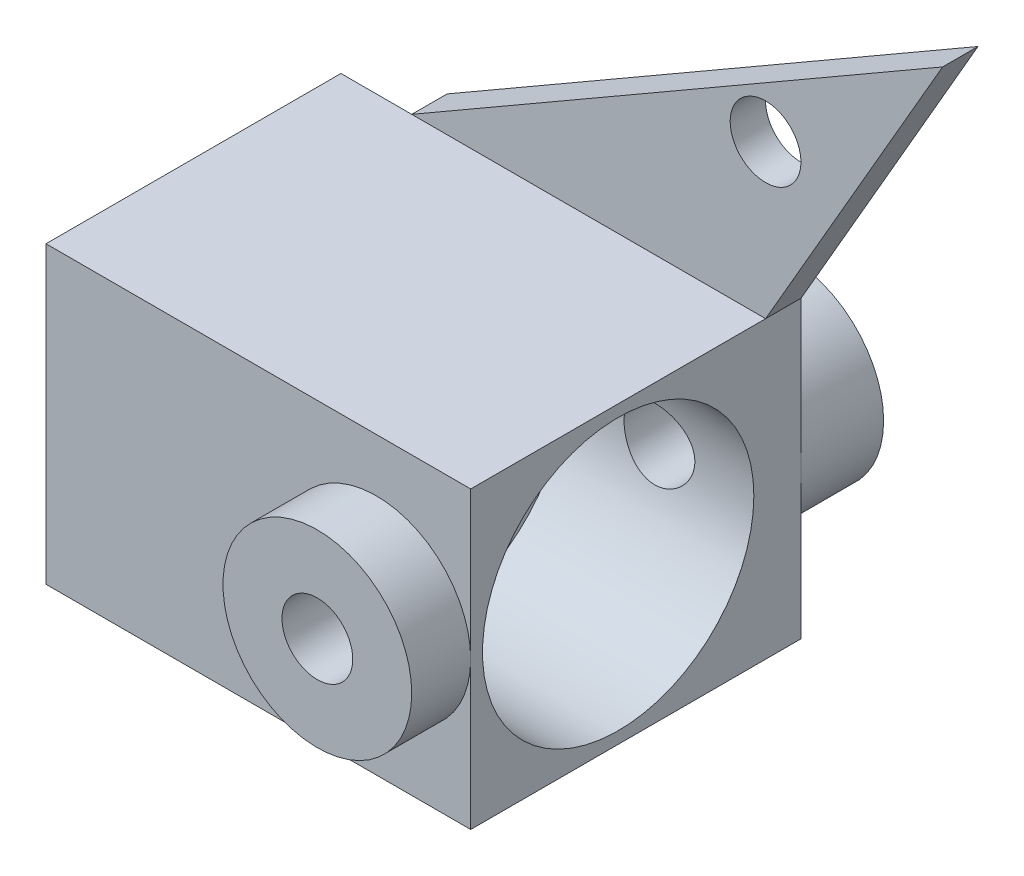
ISO-10303-21;
HEADER;
FILE_DESCRIPTION(('STEP AP214'),'2;1');
FILE_NAME('part.step','',(''),(''),'','','');
FILE_SCHEMA(('AUTOMOTIVE_DESIGN { 1 0 10303 214 1 1 1 1 }'));
ENDSEC;
DATA;
#1=APPLICATION_CONTEXT('core data for automotive mechanical design processes');
#2=APPLICATION_PROTOCOL_DEFINITION('international standard','automotive_design',2000,#1);
#3=PRODUCT_CONTEXT('',#1,'mechanical');
#4=PRODUCT('Part','Part','',(#3));
#5=PRODUCT_RELATED_PRODUCT_CATEGORY('part','',(#4));
#6=PRODUCT_DEFINITION_FORMATION('','',#4);
#7=PRODUCT_DEFINITION_CONTEXT('part definition',#1,'design');
#8=PRODUCT_DEFINITION('design','',#6,#7);
#9=PRODUCT_DEFINITION_SHAPE('','',#8);
#10=(LENGTH_UNIT() NAMED_UNIT(*) SI_UNIT(.MILLI.,.METRE.));
#11=(NAMED_UNIT(*) PLANE_ANGLE_UNIT() SI_UNIT($,.RADIAN.));
#12=(NAMED_UNIT(*) SI_UNIT($,.STERADIAN.) SOLID_ANGLE_UNIT());
#13=UNCERTAINTY_MEASURE_WITH_UNIT(LENGTH_MEASURE(1.E-05),#10,'distance_accuracy_value','');
#14=(GEOMETRIC_REPRESENTATION_CONTEXT(3) GLOBAL_UNCERTAINTY_ASSIGNED_CONTEXT((#13)) GLOBAL_UNIT_ASSIGNED_CONTEXT((#10,
#11,#12)) REPRESENTATION_CONTEXT('',''));
#15=CARTESIAN_POINT('',(0.,0.,0.));
#16=DIRECTION('',(0.,0.,1.));
#17=DIRECTION('',(1.,0.,0.));
#18=AXIS2_PLACEMENT_3D('',#15,#16,#17);
#19=CARTESIAN_POINT('',(0.,12.5,25.));
#20=DIRECTION('',(0.,1.,0.));
#21=DIRECTION('',(0.,0.,1.));
#22=AXIS2_PLACEMENT_3D('',#19,#20,#21);
#23=PLANE('',#22);
#24=DIRECTION('',(0.,0.,-1.));
#25=VECTOR('',#24,1.);
#26=CARTESIAN_POINT('',(17.5,12.5,25.));
#27=LINE('',#26,#25);
#28=CARTESIAN_POINT('',(17.5,12.5,25.));
#29=VERTEX_POINT('',#28);
#30=CARTESIAN_POINT('',(17.5,12.5,0.));
#31=VERTEX_POINT('',#30);
#32=EDGE_CURVE('E54',#29,#31,#27,.T.);
#33=ORIENTED_EDGE('',*,*,#32,.T.);
#34=DIRECTION('',(-1.,0.,0.));
#35=VECTOR('',#34,1.);
#36=CARTESIAN_POINT('',(17.5,12.5,0.));
#37=LINE('',#36,#35);
#38=CARTESIAN_POINT('',(-12.5,12.5,0.));
#39=VERTEX_POINT('',#38);
#40=EDGE_CURVE('E158',#31,#39,#37,.T.);
#41=ORIENTED_EDGE('',*,*,#40,.T.);
#42=DIRECTION('',(1.,0.,0.));
#43=VECTOR('',#42,1.);
#44=CARTESIAN_POINT('',(0.,12.5,0.));
#45=LINE('',#44,#43);
#46=CARTESIAN_POINT('',(-18.5,12.5,0.));
#47=VERTEX_POINT('',#46);
#48=EDGE_CURVE('E125',#47,#39,#45,.T.);
#49=ORIENTED_EDGE('',*,*,#48,.F.);
#50=DIRECTION('',(0.,0.,-1.));
#51=VECTOR('',#50,1.);
#52=CARTESIAN_POINT('',(-18.5,12.5,0.));
#53=LINE('',#52,#51);
#54=CARTESIAN_POINT('',(-18.5,12.5,25.));
#55=VERTEX_POINT('',#54);
#56=EDGE_CURVE('E141',#55,#47,#53,.T.);
#57=ORIENTED_EDGE('',*,*,#56,.F.);
#58=DIRECTION('',(1.,0.,0.));
#59=VECTOR('',#58,1.);
#60=CARTESIAN_POINT('',(0.,12.5,25.));
#61=LINE('',#60,#59);
#62=EDGE_CURVE('E214',#55,#29,#61,.T.);
#63=ORIENTED_EDGE('',*,*,#62,.T.);
#64=EDGE_LOOP('',(#33,#41,#49,#57,#63));
#65=FACE_BOUND('',#64,.T.);
#66=ADVANCED_FACE('F46',(#65),#23,.T.);
#67=CARTESIAN_POINT('',(0.,0.,0.));
#68=DIRECTION('',(0.,0.,1.));
#69=DIRECTION('',(1.,0.,0.));
#70=AXIS2_PLACEMENT_3D('',#67,#68,#69);
#71=PLANE('',#70);
#72=DIRECTION('',(0.,1.,0.));
#73=VECTOR('',#72,1.);
#74=CARTESIAN_POINT('',(-12.5,0.,0.));
#75=LINE('',#74,#73);
#76=CARTESIAN_POINT('',(-12.5,-12.5,0.));
#77=VERTEX_POINT('',#76);
#78=EDGE_CURVE('E122',#77,#39,#75,.T.);
#79=ORIENTED_EDGE('',*,*,#78,.F.);
#80=DIRECTION('',(1.,0.,0.));
#81=VECTOR('',#80,1.);
#82=CARTESIAN_POINT('',(0.,-12.5,0.));
#83=LINE('',#82,#81);
#84=CARTESIAN_POINT('',(-18.5,-12.5,0.));
#85=VERTEX_POINT('',#84);
#86=EDGE_CURVE('E115',#85,#77,#83,.T.);
#87=ORIENTED_EDGE('',*,*,#86,.F.);
#88=DIRECTION('',(0.,-1.,0.));
#89=VECTOR('',#88,1.);
#90=CARTESIAN_POINT('',(-18.5,12.5,0.));
#91=LINE('',#90,#89);
#92=EDGE_CURVE('E120',#47,#85,#91,.T.);
#93=ORIENTED_EDGE('',*,*,#92,.F.);
#94=ORIENTED_EDGE('',*,*,#48,.T.);
#95=EDGE_LOOP('',(#79,#87,#93,#94));
#96=FACE_BOUND('',#95,.T.);
#97=ADVANCED_FACE('F117',(#96),#71,.F.);
#98=CARTESIAN_POINT('',(9.5,0.,-10.));
#99=DIRECTION('',(0.,0.,1.));
#100=DIRECTION('',(1.,0.,0.));
#101=AXIS2_PLACEMENT_3D('',#98,#99,#100);
#102=CYLINDRICAL_SURFACE('',#101,3.);
#103=CARTESIAN_POINT('',(12.5,0.,0.999999999994318));
#104=CARTESIAN_POINT('',(12.4999958061313,0.165513100860299,1.00000261578605));
#105=CARTESIAN_POINT('',(12.4862567268818,0.331071792667569,1.00360852641583));
#106=CARTESIAN_POINT('',(12.4317553681837,0.657428520127667,1.01764330962879));
#107=CARTESIAN_POINT('',(12.3909792667408,0.818224076801244,1.02807567202709));
#108=CARTESIAN_POINT('',(12.2838132581872,1.13029583329107,1.05461056392123));
#109=CARTESIAN_POINT('',(12.2174555774255,1.28158373259807,1.0707059572049));
#110=CARTESIAN_POINT('',(12.0611273860711,1.57088220036603,1.10686126041007));
#111=CARTESIAN_POINT('',(11.9711555735508,1.70889203618857,1.12692138890587));
#112=CARTESIAN_POINT('',(11.7680371060725,1.97079048735204,1.16933565333557));
#113=CARTESIAN_POINT('',(11.6544627072966,2.09434123783155,1.19172766332375));
#114=CARTESIAN_POINT('',(11.40827790935,2.32087548199199,1.23603582075992));
#115=CARTESIAN_POINT('',(11.2756651729633,2.42385644673366,1.25795190940119));
#116=CARTESIAN_POINT('',(10.9924973047783,2.60795448399087,1.29921221666407));
#117=CARTESIAN_POINT('',(10.8416843353429,2.68868668283712,1.31850854350326));
#118=CARTESIAN_POINT('',(10.528041481103,2.82351791781966,1.35178925345616));
#119=CARTESIAN_POINT('',(10.3652137124381,2.87762163115711,1.36577456933189));
#120=CARTESIAN_POINT('',(10.035895846133,2.9564940550528,1.3864593801617));
#121=CARTESIAN_POINT('',(9.86956177362503,2.98187355292015,1.3933103163138));
#122=CARTESIAN_POINT('',(9.53486657150606,3.00448073974606,1.39940344067351));
#123=CARTESIAN_POINT('',(9.36650580845183,3.00171344526939,1.3986469847366));
#124=CARTESIAN_POINT('',(9.03727290222882,2.96859135930547,1.38974654849018));
#125=CARTESIAN_POINT('',(8.87632064812183,2.9389716144502,1.38179941370127));
#126=CARTESIAN_POINT('',(8.56175290049769,2.85416102354825,1.35972772105193));
#127=CARTESIAN_POINT('',(8.40813797183271,2.79896821228888,1.34560268844344));
#128=CARTESIAN_POINT('',(8.1106699876766,2.66396957573277,1.31259096725328));
#129=CARTESIAN_POINT('',(7.96694112372614,2.58390285471208,1.29365421247633));
#130=CARTESIAN_POINT('',(7.69469880263451,2.40161136377509,1.25318013149444));
#131=CARTESIAN_POINT('',(7.56618823075147,2.29938240245393,1.23164231370859));
#132=CARTESIAN_POINT('',(7.32382626318911,2.07189255916669,1.18757014458383));
#133=CARTESIAN_POINT('',(7.2105563268274,1.946013332897,1.16502565182396));
#134=CARTESIAN_POINT('',(7.00661795355001,1.67677263038272,1.12208325375354));
#135=CARTESIAN_POINT('',(6.91595033321012,1.53341052279567,1.101685426013));
#136=CARTESIAN_POINT('',(6.75954950120155,1.23239828878866,1.06521794335912));
#137=CARTESIAN_POINT('',(6.69391768476389,1.0746931981324,1.0491659637199));
#138=CARTESIAN_POINT('',(6.59026320193476,0.749974407216019,1.0233267982061));
#139=CARTESIAN_POINT('',(6.55223477013406,0.582962658651929,1.01353830415281));
#140=CARTESIAN_POINT('',(6.50577064496216,0.249336896290359,1.00152534029361));
#141=CARTESIAN_POINT('',(6.49654396120739,0.0828401568193054,0.999098742576637));
#142=CARTESIAN_POINT('',(6.50576612469069,-0.24932047200086,1.00150378038978));
#143=CARTESIAN_POINT('',(6.52421224328683,-0.414984441848129,1.00633470030155));
#144=CARTESIAN_POINT('',(6.58760640920778,-0.73798019797212,1.0225817643585));
#145=CARTESIAN_POINT('',(6.63211669484639,-0.895403878510947,1.03388906707069));
#146=CARTESIAN_POINT('',(6.74587031770228,-1.20053743045728,1.06180937102979));
#147=CARTESIAN_POINT('',(6.81511627409266,-1.34824627123263,1.0784229341182));
#148=CARTESIAN_POINT('',(6.97786600918619,-1.63285688723239,1.11559030801735));
#149=CARTESIAN_POINT('',(7.07180461133014,-1.7695008228384,1.13621282117842));
#150=CARTESIAN_POINT('',(7.28072321530767,-2.02536444506459,1.17901260171907));
#151=CARTESIAN_POINT('',(7.39570718759906,-2.14458083612579,1.20119016198879));
#152=CARTESIAN_POINT('',(7.64713765571247,-2.36551255989495,1.24533853475134));
#153=CARTESIAN_POINT('',(7.78407826398584,-2.46667088847343,1.26728774019604));
#154=CARTESIAN_POINT('',(8.07345121979507,-2.64457935536873,1.30783498127531));
#155=CARTESIAN_POINT('',(8.22588290134636,-2.72133054240005,1.32643316088029));
#156=CARTESIAN_POINT('',(8.54112583841064,-2.84766857265181,1.3579613427396));
#157=CARTESIAN_POINT('',(8.70386977709193,-2.89741467502046,1.37092448453461));
#158=CARTESIAN_POINT('',(9.03580585053428,-2.96872395986275,1.38973160643499));
#159=CARTESIAN_POINT('',(9.20499641292087,-2.99029396995785,1.39557731121204));
#160=CARTESIAN_POINT('',(9.53933294148051,-3.00425859429513,1.3993480420967));
#161=CARTESIAN_POINT('',(9.70443942703428,-2.99754663404827,1.39751562976714));
#162=CARTESIAN_POINT('',(10.031078743958,-2.95720046555001,1.38670198516372));
#163=CARTESIAN_POINT('',(10.1926116598178,-2.92356689450649,1.37772092209137));
#164=CARTESIAN_POINT('',(10.5064483664403,-2.83083978633454,1.35376309157632));
#165=CARTESIAN_POINT('',(10.658809313993,-2.77192786169538,1.33882914600445));
#166=CARTESIAN_POINT('',(10.9515978984777,-2.63045811008315,1.30464550165221));
#167=CARTESIAN_POINT('',(11.0920237342674,-2.54789672232776,1.28539515306733));
#168=CARTESIAN_POINT('',(11.3612392966653,-2.35873097869853,1.24406835110426));
#169=CARTESIAN_POINT('',(11.4895882249428,-2.25151328856471,1.22192742238949));
#170=CARTESIAN_POINT('',(11.726762822395,-2.01725513432171,1.17768284336483));
#171=CARTESIAN_POINT('',(11.8355837799059,-1.89020990005608,1.1555792033228));
#172=CARTESIAN_POINT('',(12.0327687767881,-1.61680516286449,1.11336600337295));
#173=CARTESIAN_POINT('',(12.1206750591729,-1.47010728053361,1.0933057574504));
#174=CARTESIAN_POINT('',(12.2704391212127,-1.16350012002815,1.05797191112365));
#175=CARTESIAN_POINT('',(12.3323143145445,-1.00359975967301,1.0426951125543));
#176=CARTESIAN_POINT('',(12.4197915871607,-0.703483555588702,1.02072600691194));
#177=CARTESIAN_POINT('',(12.449801628113,-0.564611293459929,1.01300922678294));
#178=CARTESIAN_POINT('',(12.4899067376189,-0.283837014202407,1.00264532961162));
#179=CARTESIAN_POINT('',(12.5000035964397,-0.141935270594578,0.999997756829844));
#180=CARTESIAN_POINT('',(12.5,0.,0.999999999994318));
#181=B_SPLINE_CURVE_WITH_KNOTS('',3,(#103,#104,#105,#106,#107,#108,#109,#110,#111,#112,#113,
#114,#115,#116,#117,#118,#119,#120,#121,#122,#123,#124,#125,#126,#127,#128,#129,#130,#131,#132,
#133,#134,#135,#136,#137,#138,#139,#140,#141,#142,#143,#144,#145,#146,#147,#148,#149,#150,#151,
#152,#153,#154,#155,#156,#157,#158,#159,#160,#161,#162,#163,#164,#165,#166,#167,#168,#169,#170,
#171,#172,#173,#174,#175,#176,#177,#178,#179,#180),.UNSPECIFIED.,.T.,.F.,(4,2,2,2,2,2,2,2,2,2,2,
2,2,2,2,2,2,2,2,2,2,2,2,2,2,2,2,2,2,2,2,2,2,2,2,2,2,2,4),(0.,0.496018922637786,
0.992291618127655,1.48794116718857,1.98361804884229,2.48921443639205,2.99487294596056,
3.50879636483811,4.02262948260506,4.52531823554629,5.02791739652045,5.5171608084105,
6.00644182341183,6.50103868312977,6.99572916456499,7.50583207603594,8.01595341381998,
8.52811935034126,9.04017828199353,9.53804479083304,10.0358622113971,10.5255490579065,
11.0152877710096,11.5143071256334,12.0134207233813,12.52595963138,13.0384765138731,
13.5479371169049,14.0572742446952,14.5506440866168,15.0440022513079,15.533873717558,
16.0238189801283,16.5276054380276,17.0315132854091,17.5456025841075,18.0593474302639,
18.4847452383112,18.9101047998123),.UNSPECIFIED.);
#182=CARTESIAN_POINT('',(12.5,0.,0.999999999994318));
#183=VERTEX_POINT('',#182);
#184=EDGE_CURVE('E203',#183,#183,#181,.T.);
#185=ORIENTED_EDGE('',*,*,#184,.T.);
#186=EDGE_LOOP('',(#185));
#187=FACE_BOUND('',#186,.T.);
#188=CARTESIAN_POINT('',(9.5,0.,-10.));
#189=DIRECTION('',(0.,0.,1.));
#190=DIRECTION('',(1.,0.,0.));
#191=AXIS2_PLACEMENT_3D('',#188,#189,#190);
#192=CIRCLE('',#191,3.);
#193=CARTESIAN_POINT('',(12.5,0.,-10.));
#194=VERTEX_POINT('',#193);
#195=EDGE_CURVE('E196',#194,#194,#192,.T.);
#196=ORIENTED_EDGE('',*,*,#195,.F.);
#197=EDGE_LOOP('',(#196));
#198=FACE_BOUND('',#197,.T.);
#199=ADVANCED_FACE('F286',(#187,#198),#102,.F.);
#200=CARTESIAN_POINT('',(17.5,0.,25.));
#201=DIRECTION('',(1.,0.,0.));
#202=DIRECTION('',(0.,0.,-1.));
#203=AXIS2_PLACEMENT_3D('',#200,#201,#202);
#204=PLANE('',#203);
#205=CARTESIAN_POINT('',(17.5,0.,12.4999999999943));
#206=DIRECTION('',(1.,0.,0.));
#207=DIRECTION('',(0.,0.,-1.));
#208=AXIS2_PLACEMENT_3D('',#205,#206,#207);
#209=CIRCLE('',#208,11.5);
#210=CARTESIAN_POINT('',(17.5,0.,0.999999999994316));
#211=VERTEX_POINT('',#210);
#212=EDGE_CURVE('E189',#211,#211,#209,.T.);
#213=ORIENTED_EDGE('',*,*,#212,.F.);
#214=EDGE_LOOP('',(#213));
#215=FACE_BOUND('',#214,.T.);
#216=DIRECTION('',(0.,0.,-1.));
#217=VECTOR('',#216,1.);
#218=CARTESIAN_POINT('',(17.5,-12.5,25.));
#219=LINE('',#218,#217);
#220=CARTESIAN_POINT('',(17.5,-12.5,25.));
#221=VERTEX_POINT('',#220);
#222=CARTESIAN_POINT('',(17.5,-12.5,-3.));
#223=VERTEX_POINT('',#222);
#224=EDGE_CURVE('E218',#221,#223,#219,.T.);
#225=ORIENTED_EDGE('',*,*,#224,.T.);
#226=DIRECTION('',(0.,-1.,0.));
#227=VECTOR('',#226,1.);
#228=CARTESIAN_POINT('',(17.5,12.5,-3.));
#229=LINE('',#228,#227);
#230=CARTESIAN_POINT('',(17.5,0.,-3.));
#231=VERTEX_POINT('',#230);
#232=EDGE_CURVE('E173',#231,#223,#229,.T.);
#233=ORIENTED_EDGE('',*,*,#232,.F.);
#234=CARTESIAN_POINT('',(17.5,12.5,-3.));
#235=VERTEX_POINT('',#234);
#236=EDGE_CURVE('E175',#235,#231,#229,.T.);
#237=ORIENTED_EDGE('',*,*,#236,.F.);
#238=DIRECTION('',(0.,0.,-1.));
#239=VECTOR('',#238,1.);
#240=CARTESIAN_POINT('',(17.5,12.5,0.));
#241=LINE('',#240,#239);
#242=EDGE_CURVE('E171',#31,#235,#241,.T.);
#243=ORIENTED_EDGE('',*,*,#242,.F.);
#244=ORIENTED_EDGE('',*,*,#32,.F.);
#245=DIRECTION('',(0.,-1.,0.));
#246=VECTOR('',#245,1.);
#247=CARTESIAN_POINT('',(17.5,0.,25.));
#248=LINE('',#247,#246);
#249=CARTESIAN_POINT('',(17.5,0.,25.));
#250=VERTEX_POINT('',#249);
#251=EDGE_CURVE('E212',#29,#250,#248,.T.);
#252=ORIENTED_EDGE('',*,*,#251,.T.);
#253=EDGE_CURVE('E69',#250,#221,#248,.T.);
#254=ORIENTED_EDGE('',*,*,#253,.T.);
#255=EDGE_LOOP('',(#225,#233,#237,#243,#244,#252,#254));
#256=FACE_BOUND('',#255,.T.);
#257=ADVANCED_FACE('F48',(#215,#256),#204,.T.);
#258=CARTESIAN_POINT('',(0.,-12.5,25.));
#259=DIRECTION('',(0.,1.,0.));
#260=DIRECTION('',(0.,0.,1.));
#261=AXIS2_PLACEMENT_3D('',#258,#259,#260);
#262=PLANE('',#261);
#263=ORIENTED_EDGE('',*,*,#86,.T.);
#264=DIRECTION('',(0.,0.,1.));
#265=VECTOR('',#264,1.);
#266=CARTESIAN_POINT('',(-12.5,-12.5,-3.));
#267=LINE('',#266,#265);
#268=CARTESIAN_POINT('',(-12.5,-12.5,-3.));
#269=VERTEX_POINT('',#268);
#270=EDGE_CURVE('E187',#269,#77,#267,.T.);
#271=ORIENTED_EDGE('',*,*,#270,.F.);
#272=DIRECTION('',(1.,0.,0.));
#273=VECTOR('',#272,1.);
#274=CARTESIAN_POINT('',(0.,-12.5,-3.));
#275=LINE('',#274,#273);
#276=EDGE_CURVE('E12',#269,#223,#275,.T.);
#277=ORIENTED_EDGE('',*,*,#276,.T.);
#278=ORIENTED_EDGE('',*,*,#224,.F.);
#279=DIRECTION('',(1.,0.,0.));
#280=VECTOR('',#279,1.);
#281=CARTESIAN_POINT('',(0.,-12.5,25.));
#282=LINE('',#281,#280);
#283=CARTESIAN_POINT('',(-18.5,-12.5,25.));
#284=VERTEX_POINT('',#283);
#285=EDGE_CURVE('E131',#284,#221,#282,.T.);
#286=ORIENTED_EDGE('',*,*,#285,.F.);
#287=DIRECTION('',(0.,0.,1.));
#288=VECTOR('',#287,1.);
#289=CARTESIAN_POINT('',(-18.5,-12.5,0.));
#290=LINE('',#289,#288);
#291=EDGE_CURVE('E128',#85,#284,#290,.T.);
#292=ORIENTED_EDGE('',*,*,#291,.F.);
#293=EDGE_LOOP('',(#263,#271,#277,#278,#286,#292));
#294=FACE_BOUND('',#293,.T.);
#295=ADVANCED_FACE('F129',(#294),#262,.F.);
#296=CARTESIAN_POINT('',(0.,0.,25.));
#297=DIRECTION('',(0.,0.,1.));
#298=DIRECTION('',(1.,0.,0.));
#299=AXIS2_PLACEMENT_3D('',#296,#297,#298);
#300=PLANE('',#299);
#301=ORIENTED_EDGE('',*,*,#253,.F.);
#302=CARTESIAN_POINT('',(9.5,0.,25.));
#303=DIRECTION('',(0.,0.,1.));
#304=DIRECTION('',(1.,0.,0.));
#305=AXIS2_PLACEMENT_3D('',#302,#303,#304);
#306=CIRCLE('',#305,8.);
#307=EDGE_CURVE('E206',#250,#250,#306,.T.);
#308=ORIENTED_EDGE('',*,*,#307,.F.);
#309=ORIENTED_EDGE('',*,*,#251,.F.);
#310=ORIENTED_EDGE('',*,*,#62,.F.);
#311=DIRECTION('',(0.,1.,0.));
#312=VECTOR('',#311,1.);
#313=CARTESIAN_POINT('',(-18.5,12.5,25.));
#314=LINE('',#313,#312);
#315=EDGE_CURVE('E135',#284,#55,#314,.T.);
#316=ORIENTED_EDGE('',*,*,#315,.F.);
#317=ORIENTED_EDGE('',*,*,#285,.T.);
#318=EDGE_LOOP('',(#301,#308,#309,#310,#316,#317));
#319=FACE_BOUND('',#318,.T.);
#320=ADVANCED_FACE('F290',(#319),#300,.T.);
#321=CARTESIAN_POINT('',(9.5,0.,30.));
#322=DIRECTION('',(0.,0.,-1.));
#323=DIRECTION('',(-1.,0.,0.));
#324=AXIS2_PLACEMENT_3D('',#321,#322,#323);
#325=CYLINDRICAL_SURFACE('',#324,8.);
#326=CARTESIAN_POINT('',(9.5,0.,30.));
#327=DIRECTION('',(0.,0.,1.));
#328=DIRECTION('',(1.,0.,0.));
#329=AXIS2_PLACEMENT_3D('',#326,#327,#328);
#330=CIRCLE('',#329,8.);
#331=CARTESIAN_POINT('',(17.5,0.,30.));
#332=VERTEX_POINT('',#331);
#333=EDGE_CURVE('E207',#332,#332,#330,.T.);
#334=ORIENTED_EDGE('',*,*,#333,.F.);
#335=EDGE_LOOP('',(#334));
#336=FACE_BOUND('',#335,.T.);
#337=ORIENTED_EDGE('',*,*,#307,.T.);
#338=EDGE_LOOP('',(#337));
#339=FACE_BOUND('',#338,.T.);
#340=ADVANCED_FACE('F294',(#336,#339),#325,.T.);
#341=CARTESIAN_POINT('',(9.5,0.,30.));
#342=DIRECTION('',(0.,0.,1.));
#343=DIRECTION('',(1.,0.,0.));
#344=AXIS2_PLACEMENT_3D('',#341,#342,#343);
#345=PLANE('',#344);
#346=CARTESIAN_POINT('',(9.5,0.,30.));
#347=DIRECTION('',(0.,0.,1.));
#348=DIRECTION('',(1.,0.,0.));
#349=AXIS2_PLACEMENT_3D('',#346,#347,#348);
#350=CIRCLE('',#349,3.);
#351=CARTESIAN_POINT('',(12.5,0.,30.));
#352=VERTEX_POINT('',#351);
#353=EDGE_CURVE('E200',#352,#352,#350,.T.);
#354=ORIENTED_EDGE('',*,*,#353,.F.);
#355=EDGE_LOOP('',(#354));
#356=FACE_BOUND('',#355,.T.);
#357=ORIENTED_EDGE('',*,*,#333,.T.);
#358=EDGE_LOOP('',(#357));
#359=FACE_BOUND('',#358,.T.);
#360=ADVANCED_FACE('F298',(#356,#359),#345,.T.);
#361=CARTESIAN_POINT('',(9.5,0.,-10.));
#362=DIRECTION('',(0.,0.,1.));
#363=DIRECTION('',(1.,0.,0.));
#364=AXIS2_PLACEMENT_3D('',#361,#362,#363);
#365=CYLINDRICAL_SURFACE('',#364,8.);
#366=CARTESIAN_POINT('',(9.5,0.,-3.));
#367=DIRECTION('',(0.,0.,-1.));
#368=DIRECTION('',(-1.,0.,0.));
#369=AXIS2_PLACEMENT_3D('',#366,#367,#368);
#370=CIRCLE('',#369,8.);
#371=EDGE_CURVE('E178',#231,#231,#370,.F.);
#372=ORIENTED_EDGE('',*,*,#371,.F.);
#373=EDGE_LOOP('',(#372));
#374=FACE_BOUND('',#373,.T.);
#375=CARTESIAN_POINT('',(9.5,0.,-10.));
#376=DIRECTION('',(0.,0.,-1.));
#377=DIRECTION('',(-1.,0.,0.));
#378=AXIS2_PLACEMENT_3D('',#375,#376,#377);
#379=CIRCLE('',#378,8.);
#380=CARTESIAN_POINT('',(1.5,0.,-10.));
#381=VERTEX_POINT('',#380);
#382=EDGE_CURVE('E199',#381,#381,#379,.T.);
#383=ORIENTED_EDGE('',*,*,#382,.F.);
#384=EDGE_LOOP('',(#383));
#385=FACE_BOUND('',#384,.T.);
#386=ADVANCED_FACE('F302',(#374,#385),#365,.T.);
#387=CARTESIAN_POINT('',(9.5,0.,-10.));
#388=DIRECTION('',(0.,0.,-1.));
#389=DIRECTION('',(-1.,0.,0.));
#390=AXIS2_PLACEMENT_3D('',#387,#388,#389);
#391=PLANE('',#390);
#392=ORIENTED_EDGE('',*,*,#195,.T.);
#393=EDGE_LOOP('',(#392));
#394=FACE_BOUND('',#393,.T.);
#395=ORIENTED_EDGE('',*,*,#382,.T.);
#396=EDGE_LOOP('',(#395));
#397=FACE_BOUND('',#396,.T.);
#398=ADVANCED_FACE('F305',(#394,#397),#391,.T.);
#399=CARTESIAN_POINT('',(12.5,0.,23.9999999999943));
#400=CARTESIAN_POINT('',(12.4999958061313,-0.165513100860299,23.9999973842026));
#401=CARTESIAN_POINT('',(12.4862567268818,-0.331071792667569,23.9963914735728));
#402=CARTESIAN_POINT('',(12.4317553681837,-0.657428520127667,23.9823566903598));
#403=CARTESIAN_POINT('',(12.3909792667408,-0.818224076801244,23.9719243279615));
#404=CARTESIAN_POINT('',(12.2838132581872,-1.13029583329107,23.9453894360674));
#405=CARTESIAN_POINT('',(12.2174555774255,-1.28158373259807,23.9292940427837));
#406=CARTESIAN_POINT('',(12.0611273860711,-1.57088220036603,23.8931387395786));
#407=CARTESIAN_POINT('',(11.9711555735508,-1.70889203618857,23.8730786110828));
#408=CARTESIAN_POINT('',(11.7680371060725,-1.97079048735204,23.8306643466531));
#409=CARTESIAN_POINT('',(11.6544627072966,-2.09434123783155,23.8082723366649));
#410=CARTESIAN_POINT('',(11.40827790935,-2.32087548199199,23.7639641792287));
#411=CARTESIAN_POINT('',(11.2756651729633,-2.42385644673366,23.7420480905874));
#412=CARTESIAN_POINT('',(10.9924973047783,-2.60795448399087,23.7007877833246));
#413=CARTESIAN_POINT('',(10.8416843353429,-2.68868668283712,23.6814914564854));
#414=CARTESIAN_POINT('',(10.528041481103,-2.82351791781966,23.6482107465325));
#415=CARTESIAN_POINT('',(10.3652137124381,-2.87762163115711,23.6342254306567));
#416=CARTESIAN_POINT('',(10.035895846133,-2.9564940550528,23.6135406198269));
#417=CARTESIAN_POINT('',(9.86956177362503,-2.98187355292015,23.6066896836748));
#418=CARTESIAN_POINT('',(9.53486657150606,-3.00448073974606,23.6005965593151));
#419=CARTESIAN_POINT('',(9.36650580845183,-3.00171344526939,23.601353015252));
#420=CARTESIAN_POINT('',(9.03727290222881,-2.96859135930547,23.6102534514985));
#421=CARTESIAN_POINT('',(8.87632064812182,-2.9389716144502,23.6182005862874));
#422=CARTESIAN_POINT('',(8.56175290049768,-2.85416102354825,23.6402722789367));
#423=CARTESIAN_POINT('',(8.40813797183271,-2.79896821228888,23.6543973115452));
#424=CARTESIAN_POINT('',(8.1106699876766,-2.66396957573277,23.6874090327354));
#425=CARTESIAN_POINT('',(7.96694112372614,-2.58390285471208,23.7063457875123));
#426=CARTESIAN_POINT('',(7.69469880263451,-2.40161136377509,23.7468198684942));
#427=CARTESIAN_POINT('',(7.56618823075147,-2.29938240245393,23.76835768628));
#428=CARTESIAN_POINT('',(7.32382626318911,-2.07189255916669,23.8124298554048));
#429=CARTESIAN_POINT('',(7.2105563268274,-1.946013332897,23.8349743481647));
#430=CARTESIAN_POINT('',(7.00661795355001,-1.67677263038272,23.8779167462351));
#431=CARTESIAN_POINT('',(6.91595033321012,-1.53341052279567,23.8983145739756));
#432=CARTESIAN_POINT('',(6.75954950120155,-1.23239828878866,23.9347820566295));
#433=CARTESIAN_POINT('',(6.69391768476389,-1.0746931981324,23.9508340362687));
#434=CARTESIAN_POINT('',(6.59026320193476,-0.749974407216019,23.9766732017825));
#435=CARTESIAN_POINT('',(6.55223477013406,-0.582962658651929,23.9864616958358));
#436=CARTESIAN_POINT('',(6.50577064496216,-0.249336896290359,23.998474659695));
#437=CARTESIAN_POINT('',(6.49654396120739,-0.0828401568193055,24.000901257412));
#438=CARTESIAN_POINT('',(6.50576612469069,0.24932047200086,23.9984962195989));
#439=CARTESIAN_POINT('',(6.52421224328683,0.41498444184813,23.9936652996871));
#440=CARTESIAN_POINT('',(6.58760640920778,0.73798019797212,23.9774182356301));
#441=CARTESIAN_POINT('',(6.63211669484639,0.895403878510947,23.9661109329179));
#442=CARTESIAN_POINT('',(6.74587031770228,1.20053743045728,23.9381906289588));
#443=CARTESIAN_POINT('',(6.81511627409266,1.34824627123263,23.9215770658704));
#444=CARTESIAN_POINT('',(6.97786600918619,1.63285688723239,23.8844096919713));
#445=CARTESIAN_POINT('',(7.07180461133014,1.7695008228384,23.8637871788102));
#446=CARTESIAN_POINT('',(7.28072321530767,2.02536444506459,23.8209873982696));
#447=CARTESIAN_POINT('',(7.39570718759906,2.14458083612578,23.7988098379998));
#448=CARTESIAN_POINT('',(7.64713765571247,2.36551255989495,23.7546614652373));
#449=CARTESIAN_POINT('',(7.78407826398584,2.46667088847343,23.7327122597926));
#450=CARTESIAN_POINT('',(8.07345121979507,2.64457935536873,23.6921650187133));
#451=CARTESIAN_POINT('',(8.22588290134636,2.72133054240005,23.6735668391083));
#452=CARTESIAN_POINT('',(8.54112583841064,2.84766857265181,23.642038657249));
#453=CARTESIAN_POINT('',(8.70386977709193,2.89741467502046,23.629075515454));
#454=CARTESIAN_POINT('',(9.03580585053428,2.96872395986275,23.6102683935536));
#455=CARTESIAN_POINT('',(9.20499641292087,2.99029396995785,23.6044226887766));
#456=CARTESIAN_POINT('',(9.53933294148051,3.00425859429513,23.6006519578919));
#457=CARTESIAN_POINT('',(9.70443942703428,2.99754663404827,23.6024843702215));
#458=CARTESIAN_POINT('',(10.031078743958,2.95720046555001,23.6132980148249));
#459=CARTESIAN_POINT('',(10.1926116598178,2.92356689450649,23.6222790778973));
#460=CARTESIAN_POINT('',(10.5064483664403,2.83083978633454,23.6462369084123));
#461=CARTESIAN_POINT('',(10.658809313993,2.77192786169538,23.6611708539842));
#462=CARTESIAN_POINT('',(10.9515978984777,2.63045811008315,23.6953544983364));
#463=CARTESIAN_POINT('',(11.0920237342674,2.54789672232776,23.7146048469213));
#464=CARTESIAN_POINT('',(11.3612392966653,2.35873097869853,23.7559316488844));
#465=CARTESIAN_POINT('',(11.4895882249428,2.25151328856471,23.7780725775991));
#466=CARTESIAN_POINT('',(11.726762822395,2.01725513432172,23.8223171566238));
#467=CARTESIAN_POINT('',(11.8355837799059,1.89020990005608,23.8444207966658));
#468=CARTESIAN_POINT('',(12.0327687767881,1.61680516286449,23.8866339966157));
#469=CARTESIAN_POINT('',(12.1206750591729,1.47010728053361,23.9066942425382));
#470=CARTESIAN_POINT('',(12.2704391212127,1.16350012002815,23.942028088865));
#471=CARTESIAN_POINT('',(12.3323143145445,1.00359975967301,23.9573048874343));
#472=CARTESIAN_POINT('',(12.4197915871607,0.703483555588702,23.9792739930767));
#473=CARTESIAN_POINT('',(12.449801628113,0.564611293459929,23.9869907732057));
#474=CARTESIAN_POINT('',(12.4899067376189,0.283837014202407,23.997354670377));
#475=CARTESIAN_POINT('',(12.5000035964397,0.141935270594578,24.0000022431588));
#476=CARTESIAN_POINT('',(12.5,0.,23.9999999999943));
#477=B_SPLINE_CURVE_WITH_KNOTS('',3,(#399,#400,#401,#402,#403,#404,#405,#406,#407,#408,#409,
#410,#411,#412,#413,#414,#415,#416,#417,#418,#419,#420,#421,#422,#423,#424,#425,#426,#427,#428,
#429,#430,#431,#432,#433,#434,#435,#436,#437,#438,#439,#440,#441,#442,#443,#444,#445,#446,#447,
#448,#449,#450,#451,#452,#453,#454,#455,#456,#457,#458,#459,#460,#461,#462,#463,#464,#465,#466,
#467,#468,#469,#470,#471,#472,#473,#474,#475,#476),.UNSPECIFIED.,.T.,.F.,(4,2,2,2,2,2,2,2,2,2,2,
2,2,2,2,2,2,2,2,2,2,2,2,2,2,2,2,2,2,2,2,2,2,2,2,2,2,2,4),(0.,0.496018922637785,
0.992291618127655,1.48794116718857,1.98361804884229,2.48921443639205,2.99487294596056,
3.50879636483811,4.02262948260506,4.5253182355463,5.02791739652046,5.5171608084105,
6.00644182341183,6.50103868312977,6.99572916456499,7.50583207603594,8.01595341381998,
8.52811935034126,9.04017828199353,9.53804479083304,10.0358622113971,10.5255490579065,
11.0152877710096,11.5143071256334,12.0134207233813,12.52595963138,13.0384765138731,
13.5479371169049,14.0572742446951,14.5506440866168,15.0440022513079,15.533873717558,
16.0238189801283,16.5276054380276,17.0315132854091,17.5456025841075,18.0593474302639,
18.4847452383112,18.9101047998123),.UNSPECIFIED.);
#478=CARTESIAN_POINT('',(12.5,0.,23.9999999999943));
#479=VERTEX_POINT('',#478);
#480=EDGE_CURVE('E193',#479,#479,#477,.T.);
#481=ORIENTED_EDGE('',*,*,#480,.T.);
#482=EDGE_LOOP('',(#481));
#483=FACE_BOUND('',#482,.T.);
#484=ORIENTED_EDGE('',*,*,#353,.T.);
#485=EDGE_LOOP('',(#484));
#486=FACE_BOUND('',#485,.T.);
#487=ADVANCED_FACE('F232',(#483,#486),#102,.F.);
#488=CARTESIAN_POINT('',(1.5,0.,12.4999999999943));
#489=DIRECTION('',(1.,0.,0.));
#490=DIRECTION('',(0.,0.,-1.));
#491=AXIS2_PLACEMENT_3D('',#488,#489,#490);
#492=CYLINDRICAL_SURFACE('',#491,11.5);
#493=ORIENTED_EDGE('',*,*,#480,.F.);
#494=EDGE_LOOP('',(#493));
#495=FACE_BOUND('',#494,.T.);
#496=CARTESIAN_POINT('',(1.5,0.,12.4999999999943));
#497=DIRECTION('',(1.,0.,0.));
#498=DIRECTION('',(0.,0.,-1.));
#499=AXIS2_PLACEMENT_3D('',#496,#497,#498);
#500=CIRCLE('',#499,11.5);
#501=CARTESIAN_POINT('',(1.5,0.,0.999999999994316));
#502=VERTEX_POINT('',#501);
#503=EDGE_CURVE('E190',#502,#502,#500,.T.);
#504=ORIENTED_EDGE('',*,*,#503,.F.);
#505=EDGE_LOOP('',(#504));
#506=FACE_BOUND('',#505,.T.);
#507=ORIENTED_EDGE('',*,*,#212,.T.);
#508=EDGE_LOOP('',(#507));
#509=FACE_BOUND('',#508,.T.);
#510=ORIENTED_EDGE('',*,*,#184,.F.);
#511=EDGE_LOOP('',(#510));
#512=FACE_BOUND('',#511,.T.);
#513=ADVANCED_FACE('F235',(#495,#506,#509,#512),#492,.F.);
#514=CARTESIAN_POINT('',(1.5,0.,12.4999999999943));
#515=DIRECTION('',(1.,0.,0.));
#516=DIRECTION('',(0.,0.,-1.));
#517=AXIS2_PLACEMENT_3D('',#514,#515,#516);
#518=PLANE('',#517);
#519=ORIENTED_EDGE('',*,*,#503,.T.);
#520=EDGE_LOOP('',(#519));
#521=FACE_BOUND('',#520,.T.);
#522=ADVANCED_FACE('F239',(#521),#518,.T.);
#523=CARTESIAN_POINT('',(-12.5,0.,-3.));
#524=DIRECTION('',(1.,0.,0.));
#525=DIRECTION('',(0.,0.,-1.));
#526=AXIS2_PLACEMENT_3D('',#523,#524,#525);
#527=PLANE('',#526);
#528=ORIENTED_EDGE('',*,*,#78,.T.);
#529=DIRECTION('',(0.,0.,1.));
#530=VECTOR('',#529,1.);
#531=CARTESIAN_POINT('',(-12.5,12.5,-3.));
#532=LINE('',#531,#530);
#533=CARTESIAN_POINT('',(-12.5,12.5,-3.));
#534=VERTEX_POINT('',#533);
#535=EDGE_CURVE('E184',#534,#39,#532,.T.);
#536=ORIENTED_EDGE('',*,*,#535,.F.);
#537=DIRECTION('',(0.,1.,0.));
#538=VECTOR('',#537,1.);
#539=CARTESIAN_POINT('',(-12.5,0.,-3.));
#540=LINE('',#539,#538);
#541=EDGE_CURVE('E181',#269,#534,#540,.T.);
#542=ORIENTED_EDGE('',*,*,#541,.F.);
#543=ORIENTED_EDGE('',*,*,#270,.T.);
#544=EDGE_LOOP('',(#528,#536,#542,#543));
#545=FACE_BOUND('',#544,.T.);
#546=ADVANCED_FACE('F244',(#545),#527,.F.);
#547=CARTESIAN_POINT('',(0.,0.,-3.));
#548=DIRECTION('',(0.,0.,-1.));
#549=DIRECTION('',(-1.,0.,0.));
#550=AXIS2_PLACEMENT_3D('',#547,#548,#549);
#551=PLANE('',#550);
#552=ORIENTED_EDGE('',*,*,#276,.F.);
#553=ORIENTED_EDGE('',*,*,#541,.T.);
#554=DIRECTION('',(0.866025403784439,0.5,0.));
#555=VECTOR('',#554,1.);
#556=CARTESIAN_POINT('',(32.5000000000001,38.4807621135332,-3.));
#557=LINE('',#556,#555);
#558=CARTESIAN_POINT('',(32.5000000000001,38.4807621135332,-3.));
#559=VERTEX_POINT('',#558);
#560=EDGE_CURVE('E155',#534,#559,#557,.T.);
#561=ORIENTED_EDGE('',*,*,#560,.T.);
#562=DIRECTION('',(-0.500000000000002,-0.866025403784437,0.));
#563=VECTOR('',#562,1.);
#564=CARTESIAN_POINT('',(17.5,12.5,-3.));
#565=LINE('',#564,#563);
#566=EDGE_CURVE('E161',#559,#235,#565,.T.);
#567=ORIENTED_EDGE('',*,*,#566,.T.);
#568=ORIENTED_EDGE('',*,*,#236,.T.);
#569=ORIENTED_EDGE('',*,*,#371,.T.);
#570=ORIENTED_EDGE('',*,*,#232,.T.);
#571=EDGE_LOOP('',(#552,#553,#561,#567,#568,#569,#570));
#572=FACE_BOUND('',#571,.T.);
#573=CARTESIAN_POINT('',(17.4916697508023,25.4855715851499,-3.));
#574=DIRECTION('',(0.,0.,-1.));
#575=DIRECTION('',(-1.,0.,0.));
#576=AXIS2_PLACEMENT_3D('',#573,#574,#575);
#577=CIRCLE('',#576,3.);
#578=CARTESIAN_POINT('',(14.4916697508023,25.4855715851499,-3.));
#579=VERTEX_POINT('',#578);
#580=EDGE_CURVE('E151',#579,#579,#577,.T.);
#581=ORIENTED_EDGE('',*,*,#580,.F.);
#582=EDGE_LOOP('',(#581));
#583=FACE_BOUND('',#582,.T.);
#584=ADVANCED_FACE('F248',(#572,#583),#551,.T.);
#585=CARTESIAN_POINT('',(17.5,12.5,0.));
#586=DIRECTION('',(0.866025403784437,-0.500000000000002,0.));
#587=DIRECTION('',(0.500000000000002,0.866025403784437,0.));
#588=AXIS2_PLACEMENT_3D('',#585,#586,#587);
#589=PLANE('',#588);
#590=ORIENTED_EDGE('',*,*,#566,.F.);
#591=DIRECTION('',(0.,0.,-1.));
#592=VECTOR('',#591,1.);
#593=CARTESIAN_POINT('',(32.5000000000001,38.4807621135332,0.));
#594=LINE('',#593,#592);
#595=CARTESIAN_POINT('',(32.5000000000001,38.4807621135332,0.));
#596=VERTEX_POINT('',#595);
#597=EDGE_CURVE('E166',#596,#559,#594,.T.);
#598=ORIENTED_EDGE('',*,*,#597,.F.);
#599=DIRECTION('',(-0.500000000000002,-0.866025403784437,0.));
#600=VECTOR('',#599,1.);
#601=CARTESIAN_POINT('',(17.5,12.5,0.));
#602=LINE('',#601,#600);
#603=EDGE_CURVE('E163',#596,#31,#602,.T.);
#604=ORIENTED_EDGE('',*,*,#603,.T.);
#605=ORIENTED_EDGE('',*,*,#242,.T.);
#606=EDGE_LOOP('',(#590,#598,#604,#605));
#607=FACE_BOUND('',#606,.T.);
#608=ADVANCED_FACE('F252',(#607),#589,.T.);
#609=CARTESIAN_POINT('',(32.5000000000001,38.4807621135332,0.));
#610=DIRECTION('',(-0.5,0.866025403784439,0.));
#611=DIRECTION('',(-0.866025403784439,-0.5,0.));
#612=AXIS2_PLACEMENT_3D('',#609,#610,#611);
#613=PLANE('',#612);
#614=ORIENTED_EDGE('',*,*,#560,.F.);
#615=ORIENTED_EDGE('',*,*,#535,.T.);
#616=DIRECTION('',(0.866025403784439,0.5,0.));
#617=VECTOR('',#616,1.);
#618=CARTESIAN_POINT('',(32.5000000000001,38.4807621135332,0.));
#619=LINE('',#618,#617);
#620=EDGE_CURVE('E61',#39,#596,#619,.T.);
#621=ORIENTED_EDGE('',*,*,#620,.T.);
#622=ORIENTED_EDGE('',*,*,#597,.T.);
#623=EDGE_LOOP('',(#614,#615,#621,#622));
#624=FACE_BOUND('',#623,.T.);
#625=ADVANCED_FACE('F254',(#624),#613,.T.);
#626=CARTESIAN_POINT('',(0.,0.,0.));
#627=DIRECTION('',(0.,0.,-1.));
#628=DIRECTION('',(-1.,0.,0.));
#629=AXIS2_PLACEMENT_3D('',#626,#627,#628);
#630=PLANE('',#629);
#631=CARTESIAN_POINT('',(17.4916697508023,25.4855715851499,0.));
#632=DIRECTION('',(0.,0.,-1.));
#633=DIRECTION('',(-1.,0.,0.));
#634=AXIS2_PLACEMENT_3D('',#631,#632,#633);
#635=CIRCLE('',#634,3.);
#636=CARTESIAN_POINT('',(14.4916697508023,25.4855715851499,0.));
#637=VERTEX_POINT('',#636);
#638=EDGE_CURVE('E152',#637,#637,#635,.T.);
#639=ORIENTED_EDGE('',*,*,#638,.T.);
#640=EDGE_LOOP('',(#639));
#641=FACE_BOUND('',#640,.T.);
#642=ORIENTED_EDGE('',*,*,#40,.F.);
#643=ORIENTED_EDGE('',*,*,#603,.F.);
#644=ORIENTED_EDGE('',*,*,#620,.F.);
#645=EDGE_LOOP('',(#642,#643,#644));
#646=FACE_BOUND('',#645,.T.);
#647=ADVANCED_FACE('F257',(#641,#646),#630,.F.);
#648=CARTESIAN_POINT('',(17.4916697508023,25.4855715851499,0.));
#649=DIRECTION('',(0.,0.,-1.));
#650=DIRECTION('',(-1.,0.,0.));
#651=AXIS2_PLACEMENT_3D('',#648,#649,#650);
#652=CYLINDRICAL_SURFACE('',#651,3.);
#653=ORIENTED_EDGE('',*,*,#638,.F.);
#654=EDGE_LOOP('',(#653));
#655=FACE_BOUND('',#654,.T.);
#656=ORIENTED_EDGE('',*,*,#580,.T.);
#657=EDGE_LOOP('',(#656));
#658=FACE_BOUND('',#657,.T.);
#659=ADVANCED_FACE('F264',(#655,#658),#652,.F.);
#660=CARTESIAN_POINT('',(-18.5,0.,0.));
#661=DIRECTION('',(-1.,0.,0.));
#662=DIRECTION('',(0.,0.,1.));
#663=AXIS2_PLACEMENT_3D('',#660,#661,#662);
#664=PLANE('',#663);
#665=ORIENTED_EDGE('',*,*,#92,.T.);
#666=ORIENTED_EDGE('',*,*,#291,.T.);
#667=ORIENTED_EDGE('',*,*,#315,.T.);
#668=ORIENTED_EDGE('',*,*,#56,.T.);
#669=EDGE_LOOP('',(#665,#666,#667,#668));
#670=FACE_BOUND('',#669,.T.);
#671=CARTESIAN_POINT('',(-18.5,0.,12.5));
#672=DIRECTION('',(-1.,0.,0.));
#673=DIRECTION('',(0.,0.,1.));
#674=AXIS2_PLACEMENT_3D('',#671,#672,#673);
#675=CIRCLE('',#674,4.);
#676=CARTESIAN_POINT('',(-18.5,0.,16.5));
#677=VERTEX_POINT('',#676);
#678=EDGE_CURVE('E142',#677,#677,#675,.T.);
#679=ORIENTED_EDGE('',*,*,#678,.F.);
#680=EDGE_LOOP('',(#679));
#681=FACE_BOUND('',#680,.T.);
#682=ADVANCED_FACE('F138',(#670,#681),#664,.T.);
#683=CARTESIAN_POINT('',(-18.5,0.,12.5));
#684=DIRECTION('',(1.,0.,0.));
#685=DIRECTION('',(0.,0.,-1.));
#686=AXIS2_PLACEMENT_3D('',#683,#684,#685);
#687=CYLINDRICAL_SURFACE('',#686,4.);
#688=ORIENTED_EDGE('',*,*,#678,.T.);
#689=EDGE_LOOP('',(#688));
#690=FACE_BOUND('',#689,.T.);
#691=CARTESIAN_POINT('',(-17.5,0.,12.5));
#692=DIRECTION('',(-1.,0.,0.));
#693=DIRECTION('',(0.,0.,1.));
#694=AXIS2_PLACEMENT_3D('',#691,#692,#693);
#695=CIRCLE('',#694,4.);
#696=CARTESIAN_POINT('',(-17.5,0.,16.5));
#697=VERTEX_POINT('',#696);
#698=EDGE_CURVE('E145',#697,#697,#695,.T.);
#699=ORIENTED_EDGE('',*,*,#698,.F.);
#700=EDGE_LOOP('',(#699));
#701=FACE_BOUND('',#700,.T.);
#702=ADVANCED_FACE('F271',(#690,#701),#687,.F.);
#703=CARTESIAN_POINT('',(-17.5,0.,25.));
#704=DIRECTION('',(1.,0.,0.));
#705=DIRECTION('',(0.,0.,-1.));
#706=AXIS2_PLACEMENT_3D('',#703,#704,#705);
#707=PLANE('',#706);
#708=ORIENTED_EDGE('',*,*,#698,.T.);
#709=EDGE_LOOP('',(#708));
#710=FACE_BOUND('',#709,.T.);
#711=ADVANCED_FACE('F273',(#710),#707,.F.);
#712=CLOSED_SHELL('',(#66,#97,#199,#257,#295,#320,#340,#360,#386,#398,#487,#513,#522,#546,#584,
#608,#625,#647,#659,#682,#702,#711));
#713=MANIFOLD_SOLID_BREP('B2',#712);
#714=ADVANCED_BREP_SHAPE_REPRESENTATION('',(#18,#713),#14);
#715=SHAPE_DEFINITION_REPRESENTATION(#9,#714);
ENDSEC;
END-ISO-10303-21;
